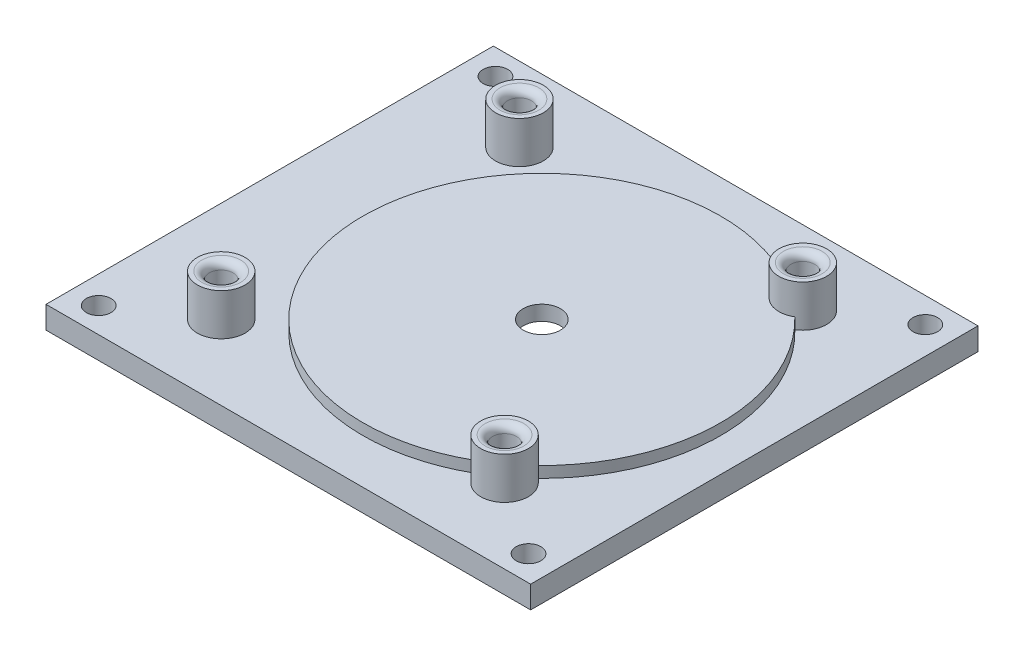
ISO-10303-21;
HEADER;
FILE_DESCRIPTION(('STEP AP214'),'2;1');
FILE_NAME('part.step','',(''),(''),'','','');
FILE_SCHEMA(('AUTOMOTIVE_DESIGN { 1 0 10303 214 1 1 1 1 }'));
ENDSEC;
DATA;
#1=APPLICATION_CONTEXT('core data for automotive mechanical design processes');
#2=APPLICATION_PROTOCOL_DEFINITION('international standard','automotive_design',2000,#1);
#3=PRODUCT_CONTEXT('',#1,'mechanical');
#4=PRODUCT('Part','Part','',(#3));
#5=PRODUCT_RELATED_PRODUCT_CATEGORY('part','',(#4));
#6=PRODUCT_DEFINITION_FORMATION('','',#4);
#7=PRODUCT_DEFINITION_CONTEXT('part definition',#1,'design');
#8=PRODUCT_DEFINITION('design','',#6,#7);
#9=PRODUCT_DEFINITION_SHAPE('','',#8);
#10=(LENGTH_UNIT() NAMED_UNIT(*) SI_UNIT(.MILLI.,.METRE.));
#11=(NAMED_UNIT(*) PLANE_ANGLE_UNIT() SI_UNIT($,.RADIAN.));
#12=(NAMED_UNIT(*) SI_UNIT($,.STERADIAN.) SOLID_ANGLE_UNIT());
#13=UNCERTAINTY_MEASURE_WITH_UNIT(LENGTH_MEASURE(1.E-05),#10,'distance_accuracy_value','');
#14=(GEOMETRIC_REPRESENTATION_CONTEXT(3) GLOBAL_UNCERTAINTY_ASSIGNED_CONTEXT((#13)) GLOBAL_UNIT_ASSIGNED_CONTEXT((#10,
#11,#12)) REPRESENTATION_CONTEXT('',''));
#15=CARTESIAN_POINT('',(0.,0.,0.));
#16=DIRECTION('',(0.,0.,1.));
#17=DIRECTION('',(1.,0.,0.));
#18=AXIS2_PLACEMENT_3D('',#15,#16,#17);
#19=CARTESIAN_POINT('',(36.4999999999855,4.5,30.));
#20=DIRECTION('',(0.,-1.,0.));
#21=DIRECTION('',(0.,0.,-1.));
#22=AXIS2_PLACEMENT_3D('',#19,#20,#21);
#23=CYLINDRICAL_SURFACE('',#22,24.);
#24=DIRECTION('',(0.,-1.,0.));
#25=VECTOR('',#24,1.);
#26=CARTESIAN_POINT('',(53.1671863015059,5.8,12.7313897261415));
#27=LINE('',#26,#25);
#28=CARTESIAN_POINT('',(53.1671863015059,4.5,12.7313897261415));
#29=VERTEX_POINT('',#28);
#30=CARTESIAN_POINT('',(53.1671863015059,3.,12.7313897261415));
#31=VERTEX_POINT('',#30);
#32=EDGE_CURVE('E249',#29,#31,#27,.T.);
#33=ORIENTED_EDGE('',*,*,#32,.F.);
#34=CARTESIAN_POINT('',(36.4999999999855,4.5,30.));
#35=DIRECTION('',(0.,1.,0.));
#36=DIRECTION('',(0.,0.,1.));
#37=AXIS2_PLACEMENT_3D('',#34,#35,#36);
#38=CIRCLE('',#37,24.);
#39=CARTESIAN_POINT('',(53.1671863015059,4.5,47.2686102738585));
#40=VERTEX_POINT('',#39);
#41=EDGE_CURVE('E136',#40,#29,#38,.T.);
#42=ORIENTED_EDGE('',*,*,#41,.F.);
#43=DIRECTION('',(0.,-1.,0.));
#44=VECTOR('',#43,1.);
#45=CARTESIAN_POINT('',(53.1671863015059,5.8,47.2686102738585));
#46=LINE('',#45,#44);
#47=CARTESIAN_POINT('',(53.1671863015059,3.,47.2686102738585));
#48=VERTEX_POINT('',#47);
#49=EDGE_CURVE('E690',#48,#40,#46,.F.);
#50=ORIENTED_EDGE('',*,*,#49,.F.);
#51=CARTESIAN_POINT('',(36.4999999999855,3.,30.));
#52=DIRECTION('',(0.,1.,0.));
#53=DIRECTION('',(0.,0.,1.));
#54=AXIS2_PLACEMENT_3D('',#51,#52,#53);
#55=CIRCLE('',#54,24.);
#56=EDGE_CURVE('E156',#48,#31,#55,.T.);
#57=ORIENTED_EDGE('',*,*,#56,.T.);
#58=EDGE_LOOP('',(#33,#42,#50,#57));
#59=FACE_BOUND('',#58,.T.);
#60=ADVANCED_FACE('F39',(#59),#23,.T.);
#61=DIRECTION('',(0.,-1.,0.));
#62=VECTOR('',#61,1.);
#63=CARTESIAN_POINT('',(48.4110536984833,5.8,9.1642902738711));
#64=LINE('',#63,#62);
#65=CARTESIAN_POINT('',(48.4110536984833,3.,9.1642902738711));
#66=VERTEX_POINT('',#65);
#67=CARTESIAN_POINT('',(48.4110536984833,4.5,9.1642902738711));
#68=VERTEX_POINT('',#67);
#69=EDGE_CURVE('E247',#66,#68,#64,.F.);
#70=ORIENTED_EDGE('',*,*,#69,.F.);
#71=CARTESIAN_POINT('',(48.4110536984833,3.,50.8357097261289));
#72=VERTEX_POINT('',#71);
#73=EDGE_CURVE('E158',#66,#72,#55,.T.);
#74=ORIENTED_EDGE('',*,*,#73,.T.);
#75=DIRECTION('',(0.,-1.,0.));
#76=VECTOR('',#75,1.);
#77=CARTESIAN_POINT('',(48.4110536984833,5.8,50.8357097261289));
#78=LINE('',#77,#76);
#79=CARTESIAN_POINT('',(48.4110536984833,4.5,50.8357097261289));
#80=VERTEX_POINT('',#79);
#81=EDGE_CURVE('E251',#80,#72,#78,.T.);
#82=ORIENTED_EDGE('',*,*,#81,.F.);
#83=EDGE_CURVE('E138',#68,#80,#38,.T.);
#84=ORIENTED_EDGE('',*,*,#83,.F.);
#85=EDGE_LOOP('',(#70,#74,#82,#84));
#86=FACE_BOUND('',#85,.T.);
#87=ADVANCED_FACE('F207',(#86),#23,.T.);
#88=CARTESIAN_POINT('',(0.,3.,0.));
#89=DIRECTION('',(0.,1.,0.));
#90=DIRECTION('',(0.,0.,1.));
#91=AXIS2_PLACEMENT_3D('',#88,#89,#90);
#92=PLANE('',#91);
#93=CARTESIAN_POINT('',(13.5,3.,50.));
#94=DIRECTION('',(0.,1.,0.));
#95=DIRECTION('',(0.,0.,1.));
#96=AXIS2_PLACEMENT_3D('',#93,#94,#95);
#97=CIRCLE('',#96,3.2);
#98=CARTESIAN_POINT('',(13.5,3.,53.2));
#99=VERTEX_POINT('',#98);
#100=EDGE_CURVE('E713',#99,#99,#97,.T.);
#101=ORIENTED_EDGE('',*,*,#100,.F.);
#102=EDGE_LOOP('',(#101));
#103=FACE_BOUND('',#102,.T.);
#104=CARTESIAN_POINT('',(13.5,3.,9.99999999999999));
#105=DIRECTION('',(0.,1.,0.));
#106=DIRECTION('',(0.,0.,1.));
#107=AXIS2_PLACEMENT_3D('',#104,#105,#106);
#108=CIRCLE('',#107,3.2);
#109=CARTESIAN_POINT('',(13.5,3.,13.2));
#110=VERTEX_POINT('',#109);
#111=EDGE_CURVE('E711',#110,#110,#108,.T.);
#112=ORIENTED_EDGE('',*,*,#111,.F.);
#113=EDGE_LOOP('',(#112));
#114=FACE_BOUND('',#113,.T.);
#115=ORIENTED_EDGE('',*,*,#73,.F.);
#116=CARTESIAN_POINT('',(51.5,3.,9.99999999999999));
#117=DIRECTION('',(0.,1.,0.));
#118=DIRECTION('',(0.,0.,1.));
#119=AXIS2_PLACEMENT_3D('',#116,#117,#118);
#120=CIRCLE('',#119,3.20000000000001);
#121=EDGE_CURVE('E694',#31,#66,#120,.T.);
#122=ORIENTED_EDGE('',*,*,#121,.F.);
#123=ORIENTED_EDGE('',*,*,#56,.F.);
#124=CARTESIAN_POINT('',(51.5,3.,50.));
#125=DIRECTION('',(0.,1.,0.));
#126=DIRECTION('',(0.,0.,1.));
#127=AXIS2_PLACEMENT_3D('',#124,#125,#126);
#128=CIRCLE('',#127,3.20000000000001);
#129=EDGE_CURVE('E718',#72,#48,#128,.T.);
#130=ORIENTED_EDGE('',*,*,#129,.F.);
#131=EDGE_LOOP('',(#115,#122,#123,#130));
#132=FACE_BOUND('',#131,.T.);
#133=CARTESIAN_POINT('',(61.3259827768626,3.,56.6085994863347));
#134=DIRECTION('',(0.,1.,0.));
#135=DIRECTION('',(0.,0.,1.));
#136=AXIS2_PLACEMENT_3D('',#133,#134,#135);
#137=CIRCLE('',#136,1.65);
#138=CARTESIAN_POINT('',(61.3259827768626,3.,58.2585994863347));
#139=VERTEX_POINT('',#138);
#140=EDGE_CURVE('E275',#139,#139,#137,.T.);
#141=ORIENTED_EDGE('',*,*,#140,.F.);
#142=EDGE_LOOP('',(#141));
#143=FACE_BOUND('',#142,.T.);
#144=CARTESIAN_POINT('',(3.67401722313746,3.,3.39140051366532));
#145=DIRECTION('',(0.,1.,0.));
#146=DIRECTION('',(0.,0.,1.));
#147=AXIS2_PLACEMENT_3D('',#144,#145,#146);
#148=CIRCLE('',#147,1.65);
#149=CARTESIAN_POINT('',(3.67401722313746,3.,5.04140051366533));
#150=VERTEX_POINT('',#149);
#151=EDGE_CURVE('E287',#150,#150,#148,.T.);
#152=ORIENTED_EDGE('',*,*,#151,.F.);
#153=EDGE_LOOP('',(#152));
#154=FACE_BOUND('',#153,.T.);
#155=DIRECTION('',(0.,0.,-1.));
#156=VECTOR('',#155,1.);
#157=CARTESIAN_POINT('',(65.,3.,60.));
#158=LINE('',#157,#156);
#159=CARTESIAN_POINT('',(65.,3.,60.));
#160=VERTEX_POINT('',#159);
#161=CARTESIAN_POINT('',(65.,3.,0.));
#162=VERTEX_POINT('',#161);
#163=EDGE_CURVE('E293',#160,#162,#158,.T.);
#164=ORIENTED_EDGE('',*,*,#163,.T.);
#165=DIRECTION('',(-1.,0.,0.));
#166=VECTOR('',#165,1.);
#167=CARTESIAN_POINT('',(65.,3.,0.));
#168=LINE('',#167,#166);
#169=CARTESIAN_POINT('',(0.,3.,0.));
#170=VERTEX_POINT('',#169);
#171=EDGE_CURVE('E296',#162,#170,#168,.T.);
#172=ORIENTED_EDGE('',*,*,#171,.T.);
#173=DIRECTION('',(0.,0.,1.));
#174=VECTOR('',#173,1.);
#175=CARTESIAN_POINT('',(0.,3.,0.));
#176=LINE('',#175,#174);
#177=CARTESIAN_POINT('',(0.,3.,60.));
#178=VERTEX_POINT('',#177);
#179=EDGE_CURVE('E299',#170,#178,#176,.T.);
#180=ORIENTED_EDGE('',*,*,#179,.T.);
#181=DIRECTION('',(1.,0.,0.));
#182=VECTOR('',#181,1.);
#183=CARTESIAN_POINT('',(0.,3.,60.));
#184=LINE('',#183,#182);
#185=EDGE_CURVE('E301',#178,#160,#184,.T.);
#186=ORIENTED_EDGE('',*,*,#185,.T.);
#187=EDGE_LOOP('',(#164,#172,#180,#186));
#188=FACE_BOUND('',#187,.T.);
#189=CARTESIAN_POINT('',(61.3259827768626,3.,3.39140051366532));
#190=DIRECTION('',(0.,1.,0.));
#191=DIRECTION('',(0.,0.,1.));
#192=AXIS2_PLACEMENT_3D('',#189,#190,#191);
#193=CIRCLE('',#192,1.65);
#194=CARTESIAN_POINT('',(61.3259827768626,3.,5.04140051366532));
#195=VERTEX_POINT('',#194);
#196=EDGE_CURVE('E281',#195,#195,#193,.T.);
#197=ORIENTED_EDGE('',*,*,#196,.F.);
#198=EDGE_LOOP('',(#197));
#199=FACE_BOUND('',#198,.T.);
#200=CARTESIAN_POINT('',(3.67401722313746,3.,56.6085994863347));
#201=DIRECTION('',(0.,1.,0.));
#202=DIRECTION('',(0.,0.,1.));
#203=AXIS2_PLACEMENT_3D('',#200,#201,#202);
#204=CIRCLE('',#203,1.65);
#205=CARTESIAN_POINT('',(3.67401722313746,3.,58.2585994863347));
#206=VERTEX_POINT('',#205);
#207=EDGE_CURVE('E269',#206,#206,#204,.T.);
#208=ORIENTED_EDGE('',*,*,#207,.F.);
#209=EDGE_LOOP('',(#208));
#210=FACE_BOUND('',#209,.T.);
#211=ADVANCED_FACE('F214',(#103,#114,#132,#143,#154,#188,#199,#210),#92,.T.);
#212=CARTESIAN_POINT('',(0.,0.,0.));
#213=DIRECTION('',(0.,1.,0.));
#214=DIRECTION('',(0.,0.,1.));
#215=AXIS2_PLACEMENT_3D('',#212,#213,#214);
#216=PLANE('',#215);
#217=CARTESIAN_POINT('',(36.4999999999855,0.,30.));
#218=DIRECTION('',(0.,1.,0.));
#219=DIRECTION('',(0.,0.,1.));
#220=AXIS2_PLACEMENT_3D('',#217,#218,#219);
#221=CIRCLE('',#220,19.);
#222=CARTESIAN_POINT('',(36.4999999999855,0.,49.));
#223=VERTEX_POINT('',#222);
#224=EDGE_CURVE('E262',#223,#223,#221,.T.);
#225=ORIENTED_EDGE('',*,*,#224,.T.);
#226=EDGE_LOOP('',(#225));
#227=FACE_BOUND('',#226,.T.);
#228=DIRECTION('',(0.,0.,-1.));
#229=VECTOR('',#228,1.);
#230=CARTESIAN_POINT('',(65.,0.,60.));
#231=LINE('',#230,#229);
#232=CARTESIAN_POINT('',(65.,0.,60.));
#233=VERTEX_POINT('',#232);
#234=CARTESIAN_POINT('',(65.,0.,0.));
#235=VERTEX_POINT('',#234);
#236=EDGE_CURVE('E290',#233,#235,#231,.T.);
#237=ORIENTED_EDGE('',*,*,#236,.F.);
#238=DIRECTION('',(1.,0.,0.));
#239=VECTOR('',#238,1.);
#240=CARTESIAN_POINT('',(0.,0.,60.));
#241=LINE('',#240,#239);
#242=CARTESIAN_POINT('',(0.,0.,60.));
#243=VERTEX_POINT('',#242);
#244=EDGE_CURVE('E297',#243,#233,#241,.T.);
#245=ORIENTED_EDGE('',*,*,#244,.F.);
#246=DIRECTION('',(0.,0.,1.));
#247=VECTOR('',#246,1.);
#248=CARTESIAN_POINT('',(0.,0.,0.));
#249=LINE('',#248,#247);
#250=CARTESIAN_POINT('',(0.,0.,0.));
#251=VERTEX_POINT('',#250);
#252=EDGE_CURVE('E308',#251,#243,#249,.T.);
#253=ORIENTED_EDGE('',*,*,#252,.F.);
#254=DIRECTION('',(-1.,0.,0.));
#255=VECTOR('',#254,1.);
#256=CARTESIAN_POINT('',(65.,0.,0.));
#257=LINE('',#256,#255);
#258=EDGE_CURVE('E306',#235,#251,#257,.T.);
#259=ORIENTED_EDGE('',*,*,#258,.F.);
#260=EDGE_LOOP('',(#237,#245,#253,#259));
#261=FACE_BOUND('',#260,.T.);
#262=CARTESIAN_POINT('',(3.67401722313746,0.,3.39140051366532));
#263=DIRECTION('',(0.,1.,0.));
#264=DIRECTION('',(0.,0.,1.));
#265=AXIS2_PLACEMENT_3D('',#262,#263,#264);
#266=CIRCLE('',#265,1.65);
#267=CARTESIAN_POINT('',(3.67401722313746,0.,5.04140051366533));
#268=VERTEX_POINT('',#267);
#269=EDGE_CURVE('E284',#268,#268,#266,.T.);
#270=ORIENTED_EDGE('',*,*,#269,.T.);
#271=EDGE_LOOP('',(#270));
#272=FACE_BOUND('',#271,.T.);
#273=CARTESIAN_POINT('',(61.3259827768626,0.,3.39140051366532));
#274=DIRECTION('',(0.,1.,0.));
#275=DIRECTION('',(0.,0.,1.));
#276=AXIS2_PLACEMENT_3D('',#273,#274,#275);
#277=CIRCLE('',#276,1.65);
#278=CARTESIAN_POINT('',(61.3259827768626,0.,5.04140051366532));
#279=VERTEX_POINT('',#278);
#280=EDGE_CURVE('E278',#279,#279,#277,.T.);
#281=ORIENTED_EDGE('',*,*,#280,.T.);
#282=EDGE_LOOP('',(#281));
#283=FACE_BOUND('',#282,.T.);
#284=CARTESIAN_POINT('',(61.3259827768626,0.,56.6085994863347));
#285=DIRECTION('',(0.,1.,0.));
#286=DIRECTION('',(0.,0.,1.));
#287=AXIS2_PLACEMENT_3D('',#284,#285,#286);
#288=CIRCLE('',#287,1.65);
#289=CARTESIAN_POINT('',(61.3259827768626,0.,58.2585994863347));
#290=VERTEX_POINT('',#289);
#291=EDGE_CURVE('E272',#290,#290,#288,.T.);
#292=ORIENTED_EDGE('',*,*,#291,.T.);
#293=EDGE_LOOP('',(#292));
#294=FACE_BOUND('',#293,.T.);
#295=CARTESIAN_POINT('',(3.67401722313746,0.,56.6085994863347));
#296=DIRECTION('',(0.,1.,0.));
#297=DIRECTION('',(0.,0.,1.));
#298=AXIS2_PLACEMENT_3D('',#295,#296,#297);
#299=CIRCLE('',#298,1.65);
#300=CARTESIAN_POINT('',(3.67401722313746,0.,58.2585994863347));
#301=VERTEX_POINT('',#300);
#302=EDGE_CURVE('E135',#301,#301,#299,.T.);
#303=ORIENTED_EDGE('',*,*,#302,.T.);
#304=EDGE_LOOP('',(#303));
#305=FACE_BOUND('',#304,.T.);
#306=ADVANCED_FACE('F330',(#227,#261,#272,#283,#294,#305),#216,.F.);
#307=CARTESIAN_POINT('',(65.,3.,60.));
#308=DIRECTION('',(-1.,0.,0.));
#309=DIRECTION('',(0.,0.,1.));
#310=AXIS2_PLACEMENT_3D('',#307,#308,#309);
#311=PLANE('',#310);
#312=ORIENTED_EDGE('',*,*,#236,.T.);
#313=DIRECTION('',(0.,-1.,0.));
#314=VECTOR('',#313,1.);
#315=CARTESIAN_POINT('',(65.,3.,0.));
#316=LINE('',#315,#314);
#317=EDGE_CURVE('E268',#162,#235,#316,.T.);
#318=ORIENTED_EDGE('',*,*,#317,.F.);
#319=ORIENTED_EDGE('',*,*,#163,.F.);
#320=DIRECTION('',(0.,-1.,0.));
#321=VECTOR('',#320,1.);
#322=CARTESIAN_POINT('',(65.,3.,60.));
#323=LINE('',#322,#321);
#324=EDGE_CURVE('E303',#160,#233,#323,.T.);
#325=ORIENTED_EDGE('',*,*,#324,.T.);
#326=EDGE_LOOP('',(#312,#318,#319,#325));
#327=FACE_BOUND('',#326,.T.);
#328=ADVANCED_FACE('F326',(#327),#311,.F.);
#329=CARTESIAN_POINT('',(65.,3.,0.));
#330=DIRECTION('',(0.,0.,1.));
#331=DIRECTION('',(1.,0.,0.));
#332=AXIS2_PLACEMENT_3D('',#329,#330,#331);
#333=PLANE('',#332);
#334=ORIENTED_EDGE('',*,*,#258,.T.);
#335=DIRECTION('',(0.,-1.,0.));
#336=VECTOR('',#335,1.);
#337=CARTESIAN_POINT('',(0.,3.,0.));
#338=LINE('',#337,#336);
#339=EDGE_CURVE('E316',#170,#251,#338,.T.);
#340=ORIENTED_EDGE('',*,*,#339,.F.);
#341=ORIENTED_EDGE('',*,*,#171,.F.);
#342=ORIENTED_EDGE('',*,*,#317,.T.);
#343=EDGE_LOOP('',(#334,#340,#341,#342));
#344=FACE_BOUND('',#343,.T.);
#345=ADVANCED_FACE('F321',(#344),#333,.F.);
#346=CARTESIAN_POINT('',(0.,3.,0.));
#347=DIRECTION('',(1.,0.,0.));
#348=DIRECTION('',(0.,0.,-1.));
#349=AXIS2_PLACEMENT_3D('',#346,#347,#348);
#350=PLANE('',#349);
#351=ORIENTED_EDGE('',*,*,#252,.T.);
#352=DIRECTION('',(0.,-1.,0.));
#353=VECTOR('',#352,1.);
#354=CARTESIAN_POINT('',(0.,3.,60.));
#355=LINE('',#354,#353);
#356=EDGE_CURVE('E313',#178,#243,#355,.T.);
#357=ORIENTED_EDGE('',*,*,#356,.F.);
#358=ORIENTED_EDGE('',*,*,#179,.F.);
#359=ORIENTED_EDGE('',*,*,#339,.T.);
#360=EDGE_LOOP('',(#351,#357,#358,#359));
#361=FACE_BOUND('',#360,.T.);
#362=ADVANCED_FACE('F335',(#361),#350,.F.);
#363=CARTESIAN_POINT('',(0.,3.,60.));
#364=DIRECTION('',(0.,0.,-1.));
#365=DIRECTION('',(-1.,0.,0.));
#366=AXIS2_PLACEMENT_3D('',#363,#364,#365);
#367=PLANE('',#366);
#368=ORIENTED_EDGE('',*,*,#244,.T.);
#369=ORIENTED_EDGE('',*,*,#324,.F.);
#370=ORIENTED_EDGE('',*,*,#185,.F.);
#371=ORIENTED_EDGE('',*,*,#356,.T.);
#372=EDGE_LOOP('',(#368,#369,#370,#371));
#373=FACE_BOUND('',#372,.T.);
#374=ADVANCED_FACE('F339',(#373),#367,.F.);
#375=CARTESIAN_POINT('',(3.67401722313746,3.,3.39140051366532));
#376=DIRECTION('',(0.,-1.,0.));
#377=DIRECTION('',(0.,0.,-1.));
#378=AXIS2_PLACEMENT_3D('',#375,#376,#377);
#379=CYLINDRICAL_SURFACE('',#378,1.65);
#380=ORIENTED_EDGE('',*,*,#151,.T.);
#381=EDGE_LOOP('',(#380));
#382=FACE_BOUND('',#381,.T.);
#383=ORIENTED_EDGE('',*,*,#269,.F.);
#384=EDGE_LOOP('',(#383));
#385=FACE_BOUND('',#384,.T.);
#386=ADVANCED_FACE('F366',(#382,#385),#379,.F.);
#387=CARTESIAN_POINT('',(61.3259827768626,3.,3.39140051366532));
#388=DIRECTION('',(0.,-1.,0.));
#389=DIRECTION('',(0.,0.,-1.));
#390=AXIS2_PLACEMENT_3D('',#387,#388,#389);
#391=CYLINDRICAL_SURFACE('',#390,1.65);
#392=ORIENTED_EDGE('',*,*,#196,.T.);
#393=EDGE_LOOP('',(#392));
#394=FACE_BOUND('',#393,.T.);
#395=ORIENTED_EDGE('',*,*,#280,.F.);
#396=EDGE_LOOP('',(#395));
#397=FACE_BOUND('',#396,.T.);
#398=ADVANCED_FACE('F615',(#394,#397),#391,.F.);
#399=CARTESIAN_POINT('',(61.3259827768626,3.,56.6085994863347));
#400=DIRECTION('',(0.,-1.,0.));
#401=DIRECTION('',(0.,0.,-1.));
#402=AXIS2_PLACEMENT_3D('',#399,#400,#401);
#403=CYLINDRICAL_SURFACE('',#402,1.65);
#404=ORIENTED_EDGE('',*,*,#140,.T.);
#405=EDGE_LOOP('',(#404));
#406=FACE_BOUND('',#405,.T.);
#407=ORIENTED_EDGE('',*,*,#291,.F.);
#408=EDGE_LOOP('',(#407));
#409=FACE_BOUND('',#408,.T.);
#410=ADVANCED_FACE('F351',(#406,#409),#403,.F.);
#411=CARTESIAN_POINT('',(3.67401722313746,3.,56.6085994863347));
#412=DIRECTION('',(0.,-1.,0.));
#413=DIRECTION('',(0.,0.,-1.));
#414=AXIS2_PLACEMENT_3D('',#411,#412,#413);
#415=CYLINDRICAL_SURFACE('',#414,1.65);
#416=ORIENTED_EDGE('',*,*,#207,.T.);
#417=EDGE_LOOP('',(#416));
#418=FACE_BOUND('',#417,.T.);
#419=ORIENTED_EDGE('',*,*,#302,.F.);
#420=EDGE_LOOP('',(#419));
#421=FACE_BOUND('',#420,.T.);
#422=ADVANCED_FACE('F348',(#418,#421),#415,.F.);
#423=CARTESIAN_POINT('',(36.4999999999855,4.5,30.));
#424=DIRECTION('',(0.,1.,0.));
#425=DIRECTION('',(0.,0.,1.));
#426=AXIS2_PLACEMENT_3D('',#423,#424,#425);
#427=PLANE('',#426);
#428=CARTESIAN_POINT('',(36.4999999999855,4.5,30.));
#429=DIRECTION('',(0.,1.,0.));
#430=DIRECTION('',(0.,0.,1.));
#431=AXIS2_PLACEMENT_3D('',#428,#429,#430);
#432=CIRCLE('',#431,2.5);
#433=CARTESIAN_POINT('',(36.4999999999855,4.5,32.5));
#434=VERTEX_POINT('',#433);
#435=EDGE_CURVE('E256',#434,#434,#432,.T.);
#436=ORIENTED_EDGE('',*,*,#435,.F.);
#437=EDGE_LOOP('',(#436));
#438=FACE_BOUND('',#437,.T.);
#439=ORIENTED_EDGE('',*,*,#41,.T.);
#440=CARTESIAN_POINT('',(51.5,4.5,9.99999999999999));
#441=DIRECTION('',(0.,1.,0.));
#442=DIRECTION('',(0.,0.,1.));
#443=AXIS2_PLACEMENT_3D('',#440,#441,#442);
#444=CIRCLE('',#443,3.20000000000001);
#445=EDGE_CURVE('E165',#29,#68,#444,.F.);
#446=ORIENTED_EDGE('',*,*,#445,.T.);
#447=ORIENTED_EDGE('',*,*,#83,.T.);
#448=CARTESIAN_POINT('',(51.5,4.5,50.));
#449=DIRECTION('',(0.,1.,0.));
#450=DIRECTION('',(0.,0.,1.));
#451=AXIS2_PLACEMENT_3D('',#448,#449,#450);
#452=CIRCLE('',#451,3.20000000000001);
#453=EDGE_CURVE('E151',#80,#40,#452,.F.);
#454=ORIENTED_EDGE('',*,*,#453,.T.);
#455=EDGE_LOOP('',(#439,#446,#447,#454));
#456=FACE_BOUND('',#455,.T.);
#457=ADVANCED_FACE('F232',(#438,#456),#427,.T.);
#458=CARTESIAN_POINT('',(36.4999999999855,2.5,30.));
#459=DIRECTION('',(0.,-1.,0.));
#460=DIRECTION('',(0.,0.,-1.));
#461=AXIS2_PLACEMENT_3D('',#458,#459,#460);
#462=CYLINDRICAL_SURFACE('',#461,19.);
#463=CARTESIAN_POINT('',(36.4999999999855,2.5,30.));
#464=DIRECTION('',(0.,1.,0.));
#465=DIRECTION('',(0.,0.,1.));
#466=AXIS2_PLACEMENT_3D('',#463,#464,#465);
#467=CIRCLE('',#466,19.);
#468=CARTESIAN_POINT('',(36.4999999999855,2.5,49.));
#469=VERTEX_POINT('',#468);
#470=EDGE_CURVE('E259',#469,#469,#467,.T.);
#471=ORIENTED_EDGE('',*,*,#470,.T.);
#472=EDGE_LOOP('',(#471));
#473=FACE_BOUND('',#472,.T.);
#474=ORIENTED_EDGE('',*,*,#224,.F.);
#475=EDGE_LOOP('',(#474));
#476=FACE_BOUND('',#475,.T.);
#477=ADVANCED_FACE('F580',(#473,#476),#462,.F.);
#478=CARTESIAN_POINT('',(36.4999999999855,2.5,30.));
#479=DIRECTION('',(0.,1.,0.));
#480=DIRECTION('',(0.,0.,1.));
#481=AXIS2_PLACEMENT_3D('',#478,#479,#480);
#482=PLANE('',#481);
#483=CARTESIAN_POINT('',(36.4999999999855,2.5,30.));
#484=DIRECTION('',(0.,1.,0.));
#485=DIRECTION('',(0.,0.,1.));
#486=AXIS2_PLACEMENT_3D('',#483,#484,#485);
#487=CIRCLE('',#486,2.5);
#488=CARTESIAN_POINT('',(36.4999999999855,2.5,32.5));
#489=VERTEX_POINT('',#488);
#490=EDGE_CURVE('E160',#489,#489,#487,.T.);
#491=ORIENTED_EDGE('',*,*,#490,.T.);
#492=EDGE_LOOP('',(#491));
#493=FACE_BOUND('',#492,.T.);
#494=ORIENTED_EDGE('',*,*,#470,.F.);
#495=EDGE_LOOP('',(#494));
#496=FACE_BOUND('',#495,.T.);
#497=ADVANCED_FACE('F570',(#493,#496),#482,.F.);
#498=CARTESIAN_POINT('',(36.4999999999855,0.,30.));
#499=DIRECTION('',(0.,1.,0.));
#500=DIRECTION('',(0.,0.,1.));
#501=AXIS2_PLACEMENT_3D('',#498,#499,#500);
#502=CYLINDRICAL_SURFACE('',#501,2.5);
#503=ORIENTED_EDGE('',*,*,#435,.T.);
#504=EDGE_LOOP('',(#503));
#505=FACE_BOUND('',#504,.T.);
#506=ORIENTED_EDGE('',*,*,#490,.F.);
#507=EDGE_LOOP('',(#506));
#508=FACE_BOUND('',#507,.T.);
#509=ADVANCED_FACE('F518',(#505,#508),#502,.F.);
#510=CARTESIAN_POINT('',(51.5,8.6,50.));
#511=DIRECTION('',(0.,-1.,0.));
#512=DIRECTION('',(0.,0.,-1.));
#513=AXIS2_PLACEMENT_3D('',#510,#511,#512);
#514=CYLINDRICAL_SURFACE('',#513,3.20000000000001);
#515=CARTESIAN_POINT('',(51.5,8.6,50.));
#516=DIRECTION('',(0.,1.,0.));
#517=DIRECTION('',(0.,0.,1.));
#518=AXIS2_PLACEMENT_3D('',#515,#516,#517);
#519=CIRCLE('',#518,3.20000000000001);
#520=CARTESIAN_POINT('',(51.5,8.6,53.2));
#521=VERTEX_POINT('',#520);
#522=EDGE_CURVE('E719',#521,#521,#519,.T.);
#523=ORIENTED_EDGE('',*,*,#522,.F.);
#524=EDGE_LOOP('',(#523));
#525=FACE_BOUND('',#524,.T.);
#526=ORIENTED_EDGE('',*,*,#453,.F.);
#527=ORIENTED_EDGE('',*,*,#81,.T.);
#528=ORIENTED_EDGE('',*,*,#129,.T.);
#529=ORIENTED_EDGE('',*,*,#49,.T.);
#530=EDGE_LOOP('',(#526,#527,#528,#529));
#531=FACE_BOUND('',#530,.T.);
#532=ADVANCED_FACE('F405',(#525,#531),#514,.T.);
#533=CARTESIAN_POINT('',(51.5,8.6,50.));
#534=DIRECTION('',(0.,-1.,0.));
#535=DIRECTION('',(0.,0.,-1.));
#536=AXIS2_PLACEMENT_3D('',#533,#534,#535);
#537=CYLINDRICAL_SURFACE('',#536,1.6);
#538=CARTESIAN_POINT('',(51.5,7.6,50.));
#539=DIRECTION('',(0.,1.,0.));
#540=DIRECTION('',(0.,0.,1.));
#541=AXIS2_PLACEMENT_3D('',#538,#539,#540);
#542=CIRCLE('',#541,1.6);
#543=CARTESIAN_POINT('',(51.5,7.6,51.6));
#544=VERTEX_POINT('',#543);
#545=EDGE_CURVE('E186',#544,#544,#542,.T.);
#546=ORIENTED_EDGE('',*,*,#545,.T.);
#547=EDGE_LOOP('',(#546));
#548=FACE_BOUND('',#547,.T.);
#549=DIRECTION('',(0.,-1.,0.));
#550=VECTOR('',#549,1.);
#551=CARTESIAN_POINT('',(49.9025864839293,5.8,49.9090601370433));
#552=LINE('',#551,#550);
#553=CARTESIAN_POINT('',(49.9025864839293,4.5,49.9090601370433));
#554=VERTEX_POINT('',#553);
#555=CARTESIAN_POINT('',(49.9025864839293,3.,49.9090601370433));
#556=VERTEX_POINT('',#555);
#557=EDGE_CURVE('E147',#554,#556,#552,.T.);
#558=ORIENTED_EDGE('',*,*,#557,.F.);
#559=CARTESIAN_POINT('',(51.5,4.5,50.));
#560=DIRECTION('',(0.,1.,0.));
#561=DIRECTION('',(0.,0.,1.));
#562=AXIS2_PLACEMENT_3D('',#559,#560,#561);
#563=CIRCLE('',#562,1.6);
#564=CARTESIAN_POINT('',(51.85997351606,4.5,48.4410198629439));
#565=VERTEX_POINT('',#564);
#566=EDGE_CURVE('E132',#554,#565,#563,.F.);
#567=ORIENTED_EDGE('',*,*,#566,.T.);
#568=DIRECTION('',(0.,-1.,0.));
#569=VECTOR('',#568,1.);
#570=CARTESIAN_POINT('',(51.85997351606,5.8,48.4410198629439));
#571=LINE('',#570,#569);
#572=CARTESIAN_POINT('',(51.85997351606,3.,48.4410198629439));
#573=VERTEX_POINT('',#572);
#574=EDGE_CURVE('E141',#573,#565,#571,.F.);
#575=ORIENTED_EDGE('',*,*,#574,.F.);
#576=CARTESIAN_POINT('',(51.5,3.,50.));
#577=DIRECTION('',(0.,1.,0.));
#578=DIRECTION('',(0.,0.,1.));
#579=AXIS2_PLACEMENT_3D('',#576,#577,#578);
#580=CIRCLE('',#579,1.6);
#581=EDGE_CURVE('E704',#556,#573,#580,.T.);
#582=ORIENTED_EDGE('',*,*,#581,.F.);
#583=EDGE_LOOP('',(#558,#567,#575,#582));
#584=FACE_BOUND('',#583,.T.);
#585=ADVANCED_FACE('F150',(#548,#584),#537,.F.);
#586=CARTESIAN_POINT('',(51.5,8.6,50.));
#587=DIRECTION('',(0.,1.,0.));
#588=DIRECTION('',(0.,0.,1.));
#589=AXIS2_PLACEMENT_3D('',#586,#587,#588);
#590=PLANE('',#589);
#591=CARTESIAN_POINT('',(51.5,8.6,50.));
#592=DIRECTION('',(0.,1.,0.));
#593=DIRECTION('',(0.,0.,1.));
#594=AXIS2_PLACEMENT_3D('',#591,#592,#593);
#595=CIRCLE('',#594,2.6);
#596=CARTESIAN_POINT('',(51.5,8.6,52.6));
#597=VERTEX_POINT('',#596);
#598=EDGE_CURVE('E189',#597,#597,#595,.F.);
#599=ORIENTED_EDGE('',*,*,#598,.T.);
#600=EDGE_LOOP('',(#599));
#601=FACE_BOUND('',#600,.T.);
#602=ORIENTED_EDGE('',*,*,#522,.T.);
#603=EDGE_LOOP('',(#602));
#604=FACE_BOUND('',#603,.T.);
#605=ADVANCED_FACE('F231',(#601,#604),#590,.T.);
#606=ORIENTED_EDGE('',*,*,#566,.F.);
#607=EDGE_CURVE('E128',#554,#565,#38,.T.);
#608=ORIENTED_EDGE('',*,*,#607,.T.);
#609=EDGE_LOOP('',(#606,#608));
#610=FACE_BOUND('',#609,.T.);
#611=ADVANCED_FACE('F130',(#610),#427,.T.);
#612=ORIENTED_EDGE('',*,*,#607,.F.);
#613=ORIENTED_EDGE('',*,*,#557,.T.);
#614=EDGE_CURVE('E144',#556,#573,#55,.T.);
#615=ORIENTED_EDGE('',*,*,#614,.T.);
#616=ORIENTED_EDGE('',*,*,#574,.T.);
#617=EDGE_LOOP('',(#612,#613,#615,#616));
#618=FACE_BOUND('',#617,.T.);
#619=ADVANCED_FACE('F142',(#618),#23,.T.);
#620=ORIENTED_EDGE('',*,*,#581,.T.);
#621=ORIENTED_EDGE('',*,*,#614,.F.);
#622=EDGE_LOOP('',(#620,#621));
#623=FACE_BOUND('',#622,.T.);
#624=ADVANCED_FACE('F221',(#623),#92,.T.);
#625=CARTESIAN_POINT('',(51.5,8.6,9.99999999999999));
#626=DIRECTION('',(0.,-1.,0.));
#627=DIRECTION('',(0.,0.,-1.));
#628=AXIS2_PLACEMENT_3D('',#625,#626,#627);
#629=CYLINDRICAL_SURFACE('',#628,3.20000000000001);
#630=CARTESIAN_POINT('',(51.5,8.6,9.99999999999999));
#631=DIRECTION('',(0.,1.,0.));
#632=DIRECTION('',(0.,0.,1.));
#633=AXIS2_PLACEMENT_3D('',#630,#631,#632);
#634=CIRCLE('',#633,3.20000000000001);
#635=CARTESIAN_POINT('',(51.5,8.6,13.2));
#636=VERTEX_POINT('',#635);
#637=EDGE_CURVE('E699',#636,#636,#634,.T.);
#638=ORIENTED_EDGE('',*,*,#637,.F.);
#639=EDGE_LOOP('',(#638));
#640=FACE_BOUND('',#639,.T.);
#641=ORIENTED_EDGE('',*,*,#445,.F.);
#642=ORIENTED_EDGE('',*,*,#32,.T.);
#643=ORIENTED_EDGE('',*,*,#121,.T.);
#644=ORIENTED_EDGE('',*,*,#69,.T.);
#645=EDGE_LOOP('',(#641,#642,#643,#644));
#646=FACE_BOUND('',#645,.T.);
#647=ADVANCED_FACE('F226',(#640,#646),#629,.T.);
#648=CARTESIAN_POINT('',(51.5,8.6,9.99999999999999));
#649=DIRECTION('',(0.,-1.,0.));
#650=DIRECTION('',(0.,0.,-1.));
#651=AXIS2_PLACEMENT_3D('',#648,#649,#650);
#652=CYLINDRICAL_SURFACE('',#651,1.6);
#653=CARTESIAN_POINT('',(51.5,7.6,9.99999999999999));
#654=DIRECTION('',(0.,1.,0.));
#655=DIRECTION('',(0.,0.,1.));
#656=AXIS2_PLACEMENT_3D('',#653,#654,#655);
#657=CIRCLE('',#656,1.6);
#658=CARTESIAN_POINT('',(51.5,7.6,11.6));
#659=VERTEX_POINT('',#658);
#660=EDGE_CURVE('E47',#659,#659,#657,.T.);
#661=ORIENTED_EDGE('',*,*,#660,.T.);
#662=EDGE_LOOP('',(#661));
#663=FACE_BOUND('',#662,.T.);
#664=DIRECTION('',(0.,-1.,0.));
#665=VECTOR('',#664,1.);
#666=CARTESIAN_POINT('',(51.85997351606,5.8,11.5589801370561));
#667=LINE('',#666,#665);
#668=CARTESIAN_POINT('',(51.85997351606,4.5,11.5589801370561));
#669=VERTEX_POINT('',#668);
#670=CARTESIAN_POINT('',(51.85997351606,3.,11.5589801370561));
#671=VERTEX_POINT('',#670);
#672=EDGE_CURVE('E60',#669,#671,#667,.T.);
#673=ORIENTED_EDGE('',*,*,#672,.F.);
#674=CARTESIAN_POINT('',(51.5,4.5,9.99999999999999));
#675=DIRECTION('',(0.,1.,0.));
#676=DIRECTION('',(0.,0.,1.));
#677=AXIS2_PLACEMENT_3D('',#674,#675,#676);
#678=CIRCLE('',#677,1.6);
#679=CARTESIAN_POINT('',(49.9025864839292,4.5,10.0909398629566));
#680=VERTEX_POINT('',#679);
#681=EDGE_CURVE('E154',#669,#680,#678,.F.);
#682=ORIENTED_EDGE('',*,*,#681,.T.);
#683=DIRECTION('',(0.,-1.,0.));
#684=VECTOR('',#683,1.);
#685=CARTESIAN_POINT('',(49.9025864839293,5.8,10.0909398629566));
#686=LINE('',#685,#684);
#687=CARTESIAN_POINT('',(49.9025864839293,3.,10.0909398629566));
#688=VERTEX_POINT('',#687);
#689=EDGE_CURVE('E246',#688,#680,#686,.F.);
#690=ORIENTED_EDGE('',*,*,#689,.F.);
#691=CARTESIAN_POINT('',(51.5,3.,9.99999999999999));
#692=DIRECTION('',(0.,1.,0.));
#693=DIRECTION('',(0.,0.,1.));
#694=AXIS2_PLACEMENT_3D('',#691,#692,#693);
#695=CIRCLE('',#694,1.6);
#696=EDGE_CURVE('E53',#671,#688,#695,.T.);
#697=ORIENTED_EDGE('',*,*,#696,.F.);
#698=EDGE_LOOP('',(#673,#682,#690,#697));
#699=FACE_BOUND('',#698,.T.);
#700=ADVANCED_FACE('F194',(#663,#699),#652,.F.);
#701=CARTESIAN_POINT('',(51.5,8.6,9.99999999999999));
#702=DIRECTION('',(0.,1.,0.));
#703=DIRECTION('',(0.,0.,1.));
#704=AXIS2_PLACEMENT_3D('',#701,#702,#703);
#705=PLANE('',#704);
#706=CARTESIAN_POINT('',(51.5,8.6,9.99999999999999));
#707=DIRECTION('',(0.,1.,0.));
#708=DIRECTION('',(0.,0.,1.));
#709=AXIS2_PLACEMENT_3D('',#706,#707,#708);
#710=CIRCLE('',#709,2.6);
#711=CARTESIAN_POINT('',(51.5,8.6,12.6));
#712=VERTEX_POINT('',#711);
#713=EDGE_CURVE('E11',#712,#712,#710,.F.);
#714=ORIENTED_EDGE('',*,*,#713,.T.);
#715=EDGE_LOOP('',(#714));
#716=FACE_BOUND('',#715,.T.);
#717=ORIENTED_EDGE('',*,*,#637,.T.);
#718=EDGE_LOOP('',(#717));
#719=FACE_BOUND('',#718,.T.);
#720=ADVANCED_FACE('F241',(#716,#719),#705,.T.);
#721=ORIENTED_EDGE('',*,*,#681,.F.);
#722=EDGE_CURVE('E244',#669,#680,#38,.T.);
#723=ORIENTED_EDGE('',*,*,#722,.T.);
#724=EDGE_LOOP('',(#721,#723));
#725=FACE_BOUND('',#724,.T.);
#726=ADVANCED_FACE('F233',(#725),#427,.T.);
#727=ORIENTED_EDGE('',*,*,#722,.F.);
#728=ORIENTED_EDGE('',*,*,#672,.T.);
#729=EDGE_CURVE('E267',#671,#688,#55,.T.);
#730=ORIENTED_EDGE('',*,*,#729,.T.);
#731=ORIENTED_EDGE('',*,*,#689,.T.);
#732=EDGE_LOOP('',(#727,#728,#730,#731));
#733=FACE_BOUND('',#732,.T.);
#734=ADVANCED_FACE('F216',(#733),#23,.T.);
#735=ORIENTED_EDGE('',*,*,#696,.T.);
#736=ORIENTED_EDGE('',*,*,#729,.F.);
#737=EDGE_LOOP('',(#735,#736));
#738=FACE_BOUND('',#737,.T.);
#739=ADVANCED_FACE('F230',(#738),#92,.T.);
#740=CARTESIAN_POINT('',(13.5,8.6,9.99999999999999));
#741=DIRECTION('',(0.,1.,0.));
#742=DIRECTION('',(0.,0.,1.));
#743=AXIS2_PLACEMENT_3D('',#740,#741,#742);
#744=PLANE('',#743);
#745=CARTESIAN_POINT('',(13.5,8.6,9.99999999999999));
#746=DIRECTION('',(0.,1.,0.));
#747=DIRECTION('',(0.,0.,1.));
#748=AXIS2_PLACEMENT_3D('',#745,#746,#747);
#749=CIRCLE('',#748,2.6);
#750=CARTESIAN_POINT('',(13.5,8.6,12.6));
#751=VERTEX_POINT('',#750);
#752=EDGE_CURVE('E177',#751,#751,#749,.F.);
#753=ORIENTED_EDGE('',*,*,#752,.T.);
#754=EDGE_LOOP('',(#753));
#755=FACE_BOUND('',#754,.T.);
#756=CARTESIAN_POINT('',(13.5,8.6,9.99999999999999));
#757=DIRECTION('',(0.,1.,0.));
#758=DIRECTION('',(0.,0.,1.));
#759=AXIS2_PLACEMENT_3D('',#756,#757,#758);
#760=CIRCLE('',#759,3.2);
#761=CARTESIAN_POINT('',(13.5,8.6,13.2));
#762=VERTEX_POINT('',#761);
#763=EDGE_CURVE('E148',#762,#762,#760,.T.);
#764=ORIENTED_EDGE('',*,*,#763,.T.);
#765=EDGE_LOOP('',(#764));
#766=FACE_BOUND('',#765,.T.);
#767=ADVANCED_FACE('F239',(#755,#766),#744,.T.);
#768=CARTESIAN_POINT('',(13.5,8.6,9.99999999999999));
#769=DIRECTION('',(0.,-1.,0.));
#770=DIRECTION('',(0.,0.,-1.));
#771=AXIS2_PLACEMENT_3D('',#768,#769,#770);
#772=CYLINDRICAL_SURFACE('',#771,3.2);
#773=ORIENTED_EDGE('',*,*,#763,.F.);
#774=EDGE_LOOP('',(#773));
#775=FACE_BOUND('',#774,.T.);
#776=ORIENTED_EDGE('',*,*,#111,.T.);
#777=EDGE_LOOP('',(#776));
#778=FACE_BOUND('',#777,.T.);
#779=ADVANCED_FACE('F439',(#775,#778),#772,.T.);
#780=CARTESIAN_POINT('',(13.5,8.6,9.99999999999999));
#781=DIRECTION('',(0.,-1.,0.));
#782=DIRECTION('',(0.,0.,-1.));
#783=AXIS2_PLACEMENT_3D('',#780,#781,#782);
#784=CYLINDRICAL_SURFACE('',#783,1.6);
#785=CARTESIAN_POINT('',(13.5,7.6,9.99999999999999));
#786=DIRECTION('',(0.,1.,0.));
#787=DIRECTION('',(0.,0.,1.));
#788=AXIS2_PLACEMENT_3D('',#785,#786,#787);
#789=CIRCLE('',#788,1.6);
#790=CARTESIAN_POINT('',(13.5,7.6,11.6));
#791=VERTEX_POINT('',#790);
#792=EDGE_CURVE('E174',#791,#791,#789,.T.);
#793=ORIENTED_EDGE('',*,*,#792,.T.);
#794=EDGE_LOOP('',(#793));
#795=FACE_BOUND('',#794,.T.);
#796=CARTESIAN_POINT('',(13.5,3.,9.99999999999999));
#797=DIRECTION('',(0.,1.,0.));
#798=DIRECTION('',(0.,0.,1.));
#799=AXIS2_PLACEMENT_3D('',#796,#797,#798);
#800=CIRCLE('',#799,1.6);
#801=CARTESIAN_POINT('',(13.5,3.,11.6));
#802=VERTEX_POINT('',#801);
#803=EDGE_CURVE('E168',#802,#802,#800,.F.);
#804=ORIENTED_EDGE('',*,*,#803,.T.);
#805=EDGE_LOOP('',(#804));
#806=FACE_BOUND('',#805,.T.);
#807=ADVANCED_FACE('F446',(#795,#806),#784,.F.);
#808=ORIENTED_EDGE('',*,*,#803,.F.);
#809=EDGE_LOOP('',(#808));
#810=FACE_BOUND('',#809,.T.);
#811=ADVANCED_FACE('F229',(#810),#92,.T.);
#812=CARTESIAN_POINT('',(13.5,8.6,50.));
#813=DIRECTION('',(0.,1.,0.));
#814=DIRECTION('',(0.,0.,1.));
#815=AXIS2_PLACEMENT_3D('',#812,#813,#814);
#816=PLANE('',#815);
#817=CARTESIAN_POINT('',(13.5,8.6,50.));
#818=DIRECTION('',(0.,1.,0.));
#819=DIRECTION('',(0.,0.,1.));
#820=AXIS2_PLACEMENT_3D('',#817,#818,#819);
#821=CIRCLE('',#820,2.6);
#822=CARTESIAN_POINT('',(13.5,8.6,52.6));
#823=VERTEX_POINT('',#822);
#824=EDGE_CURVE('E183',#823,#823,#821,.F.);
#825=ORIENTED_EDGE('',*,*,#824,.T.);
#826=EDGE_LOOP('',(#825));
#827=FACE_BOUND('',#826,.T.);
#828=CARTESIAN_POINT('',(13.5,8.6,50.));
#829=DIRECTION('',(0.,1.,0.));
#830=DIRECTION('',(0.,0.,1.));
#831=AXIS2_PLACEMENT_3D('',#828,#829,#830);
#832=CIRCLE('',#831,3.2);
#833=CARTESIAN_POINT('',(13.5,8.6,53.2));
#834=VERTEX_POINT('',#833);
#835=EDGE_CURVE('E701',#834,#834,#832,.T.);
#836=ORIENTED_EDGE('',*,*,#835,.T.);
#837=EDGE_LOOP('',(#836));
#838=FACE_BOUND('',#837,.T.);
#839=ADVANCED_FACE('F456',(#827,#838),#816,.T.);
#840=CARTESIAN_POINT('',(13.5,8.6,50.));
#841=DIRECTION('',(0.,-1.,0.));
#842=DIRECTION('',(0.,0.,-1.));
#843=AXIS2_PLACEMENT_3D('',#840,#841,#842);
#844=CYLINDRICAL_SURFACE('',#843,3.2);
#845=ORIENTED_EDGE('',*,*,#835,.F.);
#846=EDGE_LOOP('',(#845));
#847=FACE_BOUND('',#846,.T.);
#848=ORIENTED_EDGE('',*,*,#100,.T.);
#849=EDGE_LOOP('',(#848));
#850=FACE_BOUND('',#849,.T.);
#851=ADVANCED_FACE('F386',(#847,#850),#844,.T.);
#852=CARTESIAN_POINT('',(13.5,8.6,50.));
#853=DIRECTION('',(0.,-1.,0.));
#854=DIRECTION('',(0.,0.,-1.));
#855=AXIS2_PLACEMENT_3D('',#852,#853,#854);
#856=CYLINDRICAL_SURFACE('',#855,1.6);
#857=CARTESIAN_POINT('',(13.5,7.6,50.));
#858=DIRECTION('',(0.,1.,0.));
#859=DIRECTION('',(0.,0.,1.));
#860=AXIS2_PLACEMENT_3D('',#857,#858,#859);
#861=CIRCLE('',#860,1.6);
#862=CARTESIAN_POINT('',(13.5,7.6,51.6));
#863=VERTEX_POINT('',#862);
#864=EDGE_CURVE('E180',#863,#863,#861,.T.);
#865=ORIENTED_EDGE('',*,*,#864,.T.);
#866=EDGE_LOOP('',(#865));
#867=FACE_BOUND('',#866,.T.);
#868=CARTESIAN_POINT('',(13.5,3.,50.));
#869=DIRECTION('',(0.,1.,0.));
#870=DIRECTION('',(0.,0.,1.));
#871=AXIS2_PLACEMENT_3D('',#868,#869,#870);
#872=CIRCLE('',#871,1.6);
#873=CARTESIAN_POINT('',(13.5,3.,51.6));
#874=VERTEX_POINT('',#873);
#875=EDGE_CURVE('E171',#874,#874,#872,.F.);
#876=ORIENTED_EDGE('',*,*,#875,.T.);
#877=EDGE_LOOP('',(#876));
#878=FACE_BOUND('',#877,.T.);
#879=ADVANCED_FACE('F383',(#867,#878),#856,.F.);
#880=ORIENTED_EDGE('',*,*,#875,.F.);
#881=EDGE_LOOP('',(#880));
#882=FACE_BOUND('',#881,.T.);
#883=ADVANCED_FACE('F240',(#882),#92,.T.);
#884=CARTESIAN_POINT('',(13.5,7.6,9.99999999999999));
#885=DIRECTION('',(0.,1.,0.));
#886=DIRECTION('',(0.,0.,1.));
#887=AXIS2_PLACEMENT_3D('',#884,#885,#886);
#888=TOROIDAL_SURFACE('',#887,2.6,1.);
#889=ORIENTED_EDGE('',*,*,#752,.F.);
#890=EDGE_LOOP('',(#889));
#891=FACE_BOUND('',#890,.T.);
#892=ORIENTED_EDGE('',*,*,#792,.F.);
#893=EDGE_LOOP('',(#892));
#894=FACE_BOUND('',#893,.T.);
#895=ADVANCED_FACE('F371',(#891,#894),#888,.T.);
#896=CARTESIAN_POINT('',(13.5,7.6,50.));
#897=DIRECTION('',(0.,1.,0.));
#898=DIRECTION('',(0.,0.,1.));
#899=AXIS2_PLACEMENT_3D('',#896,#897,#898);
#900=TOROIDAL_SURFACE('',#899,2.6,1.);
#901=ORIENTED_EDGE('',*,*,#824,.F.);
#902=EDGE_LOOP('',(#901));
#903=FACE_BOUND('',#902,.T.);
#904=ORIENTED_EDGE('',*,*,#864,.F.);
#905=EDGE_LOOP('',(#904));
#906=FACE_BOUND('',#905,.T.);
#907=ADVANCED_FACE('F203',(#903,#906),#900,.T.);
#908=CARTESIAN_POINT('',(51.5,7.6,50.));
#909=DIRECTION('',(0.,1.,0.));
#910=DIRECTION('',(0.,0.,1.));
#911=AXIS2_PLACEMENT_3D('',#908,#909,#910);
#912=TOROIDAL_SURFACE('',#911,2.6,1.);
#913=ORIENTED_EDGE('',*,*,#598,.F.);
#914=EDGE_LOOP('',(#913));
#915=FACE_BOUND('',#914,.T.);
#916=ORIENTED_EDGE('',*,*,#545,.F.);
#917=EDGE_LOOP('',(#916));
#918=FACE_BOUND('',#917,.T.);
#919=ADVANCED_FACE('F198',(#915,#918),#912,.T.);
#920=CARTESIAN_POINT('',(51.5,7.6,9.99999999999999));
#921=DIRECTION('',(0.,1.,0.));
#922=DIRECTION('',(0.,0.,1.));
#923=AXIS2_PLACEMENT_3D('',#920,#921,#922);
#924=TOROIDAL_SURFACE('',#923,2.6,1.);
#925=ORIENTED_EDGE('',*,*,#713,.F.);
#926=EDGE_LOOP('',(#925));
#927=FACE_BOUND('',#926,.T.);
#928=ORIENTED_EDGE('',*,*,#660,.F.);
#929=EDGE_LOOP('',(#928));
#930=FACE_BOUND('',#929,.T.);
#931=ADVANCED_FACE('F41',(#927,#930),#924,.T.);
#932=CLOSED_SHELL('',(#60,#87,#211,#306,#328,#345,#362,#374,#386,#398,#410,#422,#457,#477,#497,
#509,#532,#585,#605,#611,#619,#624,#647,#700,#720,#726,#734,#739,#767,#779,#807,#811,#839,#851,
#879,#883,#895,#907,#919,#931));
#933=MANIFOLD_SOLID_BREP('B2',#932);
#934=ADVANCED_BREP_SHAPE_REPRESENTATION('',(#18,#933),#14);
#935=SHAPE_DEFINITION_REPRESENTATION(#9,#934);
ENDSEC;
END-ISO-10303-21;
